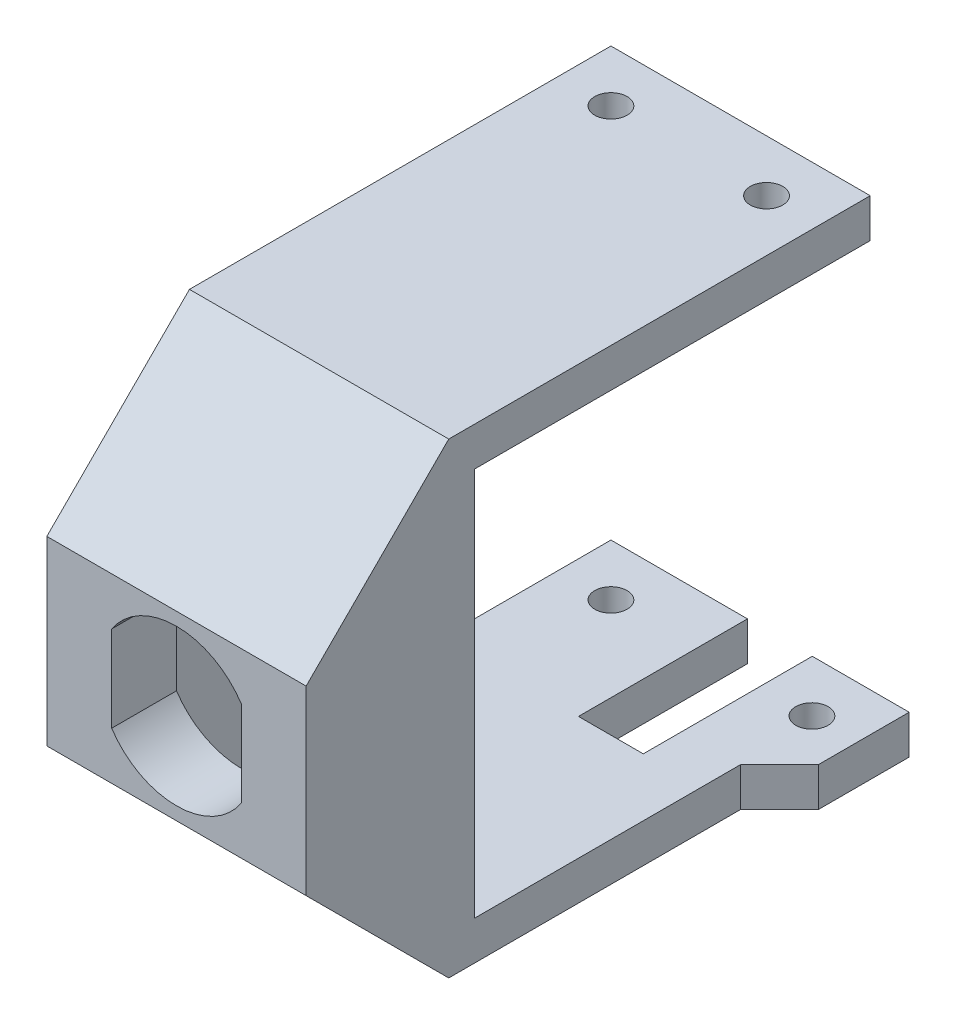
ISO-10303-21;
HEADER;
FILE_DESCRIPTION(('STEP AP214'),'2;1');
FILE_NAME('part.step','',(''),(''),'','','');
FILE_SCHEMA(('AUTOMOTIVE_DESIGN { 1 0 10303 214 1 1 1 1 }'));
ENDSEC;
DATA;
#1=APPLICATION_CONTEXT('core data for automotive mechanical design processes');
#2=APPLICATION_PROTOCOL_DEFINITION('international standard','automotive_design',2000,#1);
#3=PRODUCT_CONTEXT('',#1,'mechanical');
#4=PRODUCT('Part','Part','',(#3));
#5=PRODUCT_RELATED_PRODUCT_CATEGORY('part','',(#4));
#6=PRODUCT_DEFINITION_FORMATION('','',#4);
#7=PRODUCT_DEFINITION_CONTEXT('part definition',#1,'design');
#8=PRODUCT_DEFINITION('design','',#6,#7);
#9=PRODUCT_DEFINITION_SHAPE('','',#8);
#10=(LENGTH_UNIT() NAMED_UNIT(*) SI_UNIT(.MILLI.,.METRE.));
#11=(NAMED_UNIT(*) PLANE_ANGLE_UNIT() SI_UNIT($,.RADIAN.));
#12=(NAMED_UNIT(*) SI_UNIT($,.STERADIAN.) SOLID_ANGLE_UNIT());
#13=UNCERTAINTY_MEASURE_WITH_UNIT(LENGTH_MEASURE(1.E-05),#10,'distance_accuracy_value','');
#14=(GEOMETRIC_REPRESENTATION_CONTEXT(3) GLOBAL_UNCERTAINTY_ASSIGNED_CONTEXT((#13)) GLOBAL_UNIT_ASSIGNED_CONTEXT((#10,
#11,#12)) REPRESENTATION_CONTEXT('',''));
#15=CARTESIAN_POINT('',(0.,0.,0.));
#16=DIRECTION('',(0.,0.,1.));
#17=DIRECTION('',(1.,0.,0.));
#18=AXIS2_PLACEMENT_3D('',#15,#16,#17);
#19=CARTESIAN_POINT('',(109.3,15.,43.51));
#20=DIRECTION('',(-1.,0.,0.));
#21=DIRECTION('',(0.,0.,1.));
#22=AXIS2_PLACEMENT_3D('',#19,#20,#21);
#23=PLANE('',#22);
#24=DIRECTION('',(0.,-1.,0.));
#25=VECTOR('',#24,1.);
#26=CARTESIAN_POINT('',(109.3,15.,30.51));
#27=LINE('',#26,#25);
#28=CARTESIAN_POINT('',(109.3,15.,30.51));
#29=VERTEX_POINT('',#28);
#30=CARTESIAN_POINT('',(109.3,-15.,30.51));
#31=VERTEX_POINT('',#30);
#32=EDGE_CURVE('E224',#29,#31,#27,.T.);
#33=ORIENTED_EDGE('',*,*,#32,.F.);
#34=DIRECTION('',(0.,0.,1.));
#35=VECTOR('',#34,1.);
#36=CARTESIAN_POINT('',(109.3,15.,-20.2237484161567));
#37=LINE('',#36,#35);
#38=CARTESIAN_POINT('',(109.3,15.,0.));
#39=VERTEX_POINT('',#38);
#40=EDGE_CURVE('E320',#39,#29,#37,.T.);
#41=ORIENTED_EDGE('',*,*,#40,.F.);
#42=DIRECTION('',(0.,-1.,0.));
#43=VECTOR('',#42,1.);
#44=CARTESIAN_POINT('',(109.3,0.,0.));
#45=LINE('',#44,#43);
#46=CARTESIAN_POINT('',(109.3,18.,0.));
#47=VERTEX_POINT('',#46);
#48=EDGE_CURVE('E310',#47,#39,#45,.T.);
#49=ORIENTED_EDGE('',*,*,#48,.F.);
#50=DIRECTION('',(0.,0.,1.));
#51=VECTOR('',#50,1.);
#52=CARTESIAN_POINT('',(109.3,18.,-20.2237484161567));
#53=LINE('',#52,#51);
#54=CARTESIAN_POINT('',(109.3,18.,32.5099999999999));
#55=VERTEX_POINT('',#54);
#56=EDGE_CURVE('E271',#47,#55,#53,.T.);
#57=ORIENTED_EDGE('',*,*,#56,.T.);
#58=DIRECTION('',(0.,-0.707106781186548,0.707106781186548));
#59=VECTOR('',#58,1.);
#60=CARTESIAN_POINT('',(109.3,18.,32.5099999999999));
#61=LINE('',#60,#59);
#62=CARTESIAN_POINT('',(109.3,6.99999999999998,43.51));
#63=VERTEX_POINT('',#62);
#64=EDGE_CURVE('E247',#55,#63,#61,.T.);
#65=ORIENTED_EDGE('',*,*,#64,.T.);
#66=DIRECTION('',(0.,1.,0.));
#67=VECTOR('',#66,1.);
#68=CARTESIAN_POINT('',(109.3,15.,43.51));
#69=LINE('',#68,#67);
#70=CARTESIAN_POINT('',(109.3,-6.99999999999996,43.51));
#71=VERTEX_POINT('',#70);
#72=EDGE_CURVE('E278',#71,#63,#69,.T.);
#73=ORIENTED_EDGE('',*,*,#72,.F.);
#74=DIRECTION('',(0.,0.707106781186548,0.707106781186548));
#75=VECTOR('',#74,1.);
#76=CARTESIAN_POINT('',(109.3,-6.99999999999997,43.51));
#77=LINE('',#76,#75);
#78=CARTESIAN_POINT('',(109.3,-18.,32.5099999999999));
#79=VERTEX_POINT('',#78);
#80=EDGE_CURVE('E245',#71,#79,#77,.F.);
#81=ORIENTED_EDGE('',*,*,#80,.T.);
#82=DIRECTION('',(0.,0.,1.));
#83=VECTOR('',#82,1.);
#84=CARTESIAN_POINT('',(109.3,-18.,-20.2237484161567));
#85=LINE('',#84,#83);
#86=CARTESIAN_POINT('',(109.3,-18.,10.));
#87=VERTEX_POINT('',#86);
#88=EDGE_CURVE('E346',#87,#79,#85,.T.);
#89=ORIENTED_EDGE('',*,*,#88,.F.);
#90=DIRECTION('',(0.,-1.,0.));
#91=VECTOR('',#90,1.);
#92=CARTESIAN_POINT('',(109.3,-4.55892797145652,10.));
#93=LINE('',#92,#91);
#94=CARTESIAN_POINT('',(109.3,-15.,10.));
#95=VERTEX_POINT('',#94);
#96=EDGE_CURVE('E384',#95,#87,#93,.T.);
#97=ORIENTED_EDGE('',*,*,#96,.F.);
#98=DIRECTION('',(0.,0.,1.));
#99=VECTOR('',#98,1.);
#100=CARTESIAN_POINT('',(109.3,-15.,-20.2237484161567));
#101=LINE('',#100,#99);
#102=EDGE_CURVE('E337',#95,#31,#101,.T.);
#103=ORIENTED_EDGE('',*,*,#102,.T.);
#104=EDGE_LOOP('',(#33,#41,#49,#57,#65,#73,#81,#89,#97,#103));
#105=FACE_BOUND('',#104,.T.);
#106=ADVANCED_FACE('F40',(#105),#23,.F.);
#107=CARTESIAN_POINT('',(0.,0.,0.));
#108=DIRECTION('',(0.,0.,1.));
#109=DIRECTION('',(1.,0.,0.));
#110=AXIS2_PLACEMENT_3D('',#107,#108,#109);
#111=PLANE('',#110);
#112=DIRECTION('',(-1.,0.,0.));
#113=VECTOR('',#112,1.);
#114=CARTESIAN_POINT('',(0.,-15.,0.));
#115=LINE('',#114,#113);
#116=CARTESIAN_POINT('',(99.8296637485555,-15.,0.));
#117=VERTEX_POINT('',#116);
#118=CARTESIAN_POINT('',(89.3,-15.,0.));
#119=VERTEX_POINT('',#118);
#120=EDGE_CURVE('E336',#117,#119,#115,.T.);
#121=ORIENTED_EDGE('',*,*,#120,.F.);
#122=DIRECTION('',(0.,-1.,0.));
#123=VECTOR('',#122,1.);
#124=CARTESIAN_POINT('',(99.8296637485555,18.001,0.));
#125=LINE('',#124,#123);
#126=CARTESIAN_POINT('',(99.8296637485555,-18.,0.));
#127=VERTEX_POINT('',#126);
#128=EDGE_CURVE('E356',#117,#127,#125,.T.);
#129=ORIENTED_EDGE('',*,*,#128,.T.);
#130=DIRECTION('',(-1.,0.,0.));
#131=VECTOR('',#130,1.);
#132=CARTESIAN_POINT('',(0.,-18.,0.));
#133=LINE('',#132,#131);
#134=CARTESIAN_POINT('',(89.3,-18.,0.));
#135=VERTEX_POINT('',#134);
#136=EDGE_CURVE('E350',#127,#135,#133,.T.);
#137=ORIENTED_EDGE('',*,*,#136,.T.);
#138=DIRECTION('',(0.,1.,0.));
#139=VECTOR('',#138,1.);
#140=CARTESIAN_POINT('',(89.3,0.,0.));
#141=LINE('',#140,#139);
#142=EDGE_CURVE('E335',#135,#119,#141,.T.);
#143=ORIENTED_EDGE('',*,*,#142,.T.);
#144=EDGE_LOOP('',(#121,#129,#137,#143));
#145=FACE_BOUND('',#144,.T.);
#146=ADVANCED_FACE('F469',(#145),#111,.F.);
#147=CARTESIAN_POINT('',(0.,0.,43.51));
#148=DIRECTION('',(0.,0.,1.));
#149=DIRECTION('',(1.,0.,0.));
#150=AXIS2_PLACEMENT_3D('',#147,#148,#149);
#151=PLANE('',#150);
#152=ORIENTED_EDGE('',*,*,#72,.T.);
#153=DIRECTION('',(-1.,0.,0.));
#154=VECTOR('',#153,1.);
#155=CARTESIAN_POINT('',(89.3,6.99999999999998,43.51));
#156=LINE('',#155,#154);
#157=CARTESIAN_POINT('',(89.3,6.99999999999998,43.51));
#158=VERTEX_POINT('',#157);
#159=EDGE_CURVE('E252',#63,#158,#156,.T.);
#160=ORIENTED_EDGE('',*,*,#159,.T.);
#161=DIRECTION('',(0.,-1.,0.));
#162=VECTOR('',#161,1.);
#163=CARTESIAN_POINT('',(89.3,15.,43.51));
#164=LINE('',#163,#162);
#165=CARTESIAN_POINT('',(89.3,-6.99999999999996,43.51));
#166=VERTEX_POINT('',#165);
#167=EDGE_CURVE('E260',#158,#166,#164,.T.);
#168=ORIENTED_EDGE('',*,*,#167,.T.);
#169=DIRECTION('',(1.,0.,0.));
#170=VECTOR('',#169,1.);
#171=CARTESIAN_POINT('',(0.,-6.99999999999998,43.51));
#172=LINE('',#171,#170);
#173=EDGE_CURVE('E249',#166,#71,#172,.T.);
#174=ORIENTED_EDGE('',*,*,#173,.T.);
#175=EDGE_LOOP('',(#152,#160,#168,#174));
#176=FACE_BOUND('',#175,.T.);
#177=DIRECTION('',(0.,1.,0.));
#178=VECTOR('',#177,1.);
#179=CARTESIAN_POINT('',(104.3,-3.31662479035541,43.51));
#180=LINE('',#179,#178);
#181=CARTESIAN_POINT('',(104.3,-3.31662479035541,43.51));
#182=VERTEX_POINT('',#181);
#183=CARTESIAN_POINT('',(104.3,3.31662479035541,43.51));
#184=VERTEX_POINT('',#183);
#185=EDGE_CURVE('E315',#182,#184,#180,.T.);
#186=ORIENTED_EDGE('',*,*,#185,.F.);
#187=CARTESIAN_POINT('',(99.3,0.,43.51));
#188=DIRECTION('',(0.,0.,1.));
#189=DIRECTION('',(1.,0.,0.));
#190=AXIS2_PLACEMENT_3D('',#187,#188,#189);
#191=CIRCLE('',#190,6.00000000000001);
#192=CARTESIAN_POINT('',(94.3,-3.3166247903554,43.51));
#193=VERTEX_POINT('',#192);
#194=EDGE_CURVE('E300',#193,#182,#191,.T.);
#195=ORIENTED_EDGE('',*,*,#194,.F.);
#196=DIRECTION('',(0.,-1.,0.));
#197=VECTOR('',#196,1.);
#198=CARTESIAN_POINT('',(94.3,3.3166247903554,43.51));
#199=LINE('',#198,#197);
#200=CARTESIAN_POINT('',(94.3,3.3166247903554,43.51));
#201=VERTEX_POINT('',#200);
#202=EDGE_CURVE('E296',#201,#193,#199,.T.);
#203=ORIENTED_EDGE('',*,*,#202,.F.);
#204=CARTESIAN_POINT('',(99.3,0.,43.51));
#205=DIRECTION('',(0.,0.,1.));
#206=DIRECTION('',(1.,0.,0.));
#207=AXIS2_PLACEMENT_3D('',#204,#205,#206);
#208=CIRCLE('',#207,6.00000000000001);
#209=EDGE_CURVE('E312',#184,#201,#208,.T.);
#210=ORIENTED_EDGE('',*,*,#209,.F.);
#211=EDGE_LOOP('',(#186,#195,#203,#210));
#212=FACE_BOUND('',#211,.T.);
#213=ADVANCED_FACE('F281',(#176,#212),#151,.T.);
#214=CARTESIAN_POINT('',(0.,0.,38.51));
#215=DIRECTION('',(0.,0.,1.));
#216=DIRECTION('',(1.,0.,0.));
#217=AXIS2_PLACEMENT_3D('',#214,#215,#216);
#218=PLANE('',#217);
#219=DIRECTION('',(1.,0.,0.));
#220=VECTOR('',#219,1.);
#221=CARTESIAN_POINT('',(109.3,7.00000000000004,38.51));
#222=LINE('',#221,#220);
#223=CARTESIAN_POINT('',(92.3,7.00000000000004,38.51));
#224=VERTEX_POINT('',#223);
#225=CARTESIAN_POINT('',(106.3,7.00000000000004,38.51));
#226=VERTEX_POINT('',#225);
#227=EDGE_CURVE('E223',#224,#226,#222,.T.);
#228=ORIENTED_EDGE('',*,*,#227,.T.);
#229=DIRECTION('',(0.,1.,0.));
#230=VECTOR('',#229,1.);
#231=CARTESIAN_POINT('',(106.3,7.00000000000004,38.51));
#232=LINE('',#231,#230);
#233=CARTESIAN_POINT('',(106.3,-7.00000000000003,38.51));
#234=VERTEX_POINT('',#233);
#235=EDGE_CURVE('E205',#234,#226,#232,.T.);
#236=ORIENTED_EDGE('',*,*,#235,.F.);
#237=DIRECTION('',(-1.,0.,0.));
#238=VECTOR('',#237,1.);
#239=CARTESIAN_POINT('',(89.3,-7.00000000000004,38.51));
#240=LINE('',#239,#238);
#241=CARTESIAN_POINT('',(92.3,-7.00000000000003,38.51));
#242=VERTEX_POINT('',#241);
#243=EDGE_CURVE('E220',#234,#242,#240,.T.);
#244=ORIENTED_EDGE('',*,*,#243,.T.);
#245=DIRECTION('',(0.,1.,0.));
#246=VECTOR('',#245,1.);
#247=CARTESIAN_POINT('',(92.3,7.00000000000004,38.51));
#248=LINE('',#247,#246);
#249=EDGE_CURVE('E425',#242,#224,#248,.T.);
#250=ORIENTED_EDGE('',*,*,#249,.T.);
#251=EDGE_LOOP('',(#228,#236,#244,#250));
#252=FACE_BOUND('',#251,.T.);
#253=CARTESIAN_POINT('',(99.3,0.,38.51));
#254=DIRECTION('',(0.,0.,1.));
#255=DIRECTION('',(1.,0.,0.));
#256=AXIS2_PLACEMENT_3D('',#253,#254,#255);
#257=CIRCLE('',#256,6.00000000000001);
#258=CARTESIAN_POINT('',(94.3,-3.3166247903554,38.51));
#259=VERTEX_POINT('',#258);
#260=CARTESIAN_POINT('',(104.3,-3.31662479035541,38.51));
#261=VERTEX_POINT('',#260);
#262=EDGE_CURVE('E307',#259,#261,#257,.T.);
#263=ORIENTED_EDGE('',*,*,#262,.T.);
#264=DIRECTION('',(0.,1.,0.));
#265=VECTOR('',#264,1.);
#266=CARTESIAN_POINT('',(104.3,-3.31662479035541,38.51));
#267=LINE('',#266,#265);
#268=CARTESIAN_POINT('',(104.3,3.31662479035541,38.51));
#269=VERTEX_POINT('',#268);
#270=EDGE_CURVE('E304',#261,#269,#267,.T.);
#271=ORIENTED_EDGE('',*,*,#270,.T.);
#272=CARTESIAN_POINT('',(99.3,0.,38.51));
#273=DIRECTION('',(0.,0.,1.));
#274=DIRECTION('',(1.,0.,0.));
#275=AXIS2_PLACEMENT_3D('',#272,#273,#274);
#276=CIRCLE('',#275,6.00000000000001);
#277=CARTESIAN_POINT('',(94.3,3.3166247903554,38.51));
#278=VERTEX_POINT('',#277);
#279=EDGE_CURVE('E301',#269,#278,#276,.T.);
#280=ORIENTED_EDGE('',*,*,#279,.T.);
#281=DIRECTION('',(0.,-1.,0.));
#282=VECTOR('',#281,1.);
#283=CARTESIAN_POINT('',(94.3,3.3166247903554,38.51));
#284=LINE('',#283,#282);
#285=EDGE_CURVE('E297',#278,#259,#284,.T.);
#286=ORIENTED_EDGE('',*,*,#285,.T.);
#287=EDGE_LOOP('',(#263,#271,#280,#286));
#288=FACE_BOUND('',#287,.T.);
#289=ADVANCED_FACE('F217',(#252,#288),#218,.F.);
#290=CARTESIAN_POINT('',(89.3,15.,43.51));
#291=DIRECTION('',(1.,0.,0.));
#292=DIRECTION('',(0.,0.,-1.));
#293=AXIS2_PLACEMENT_3D('',#290,#291,#292);
#294=PLANE('',#293);
#295=ORIENTED_EDGE('',*,*,#167,.F.);
#296=DIRECTION('',(0.,0.707106781186548,-0.707106781186548));
#297=VECTOR('',#296,1.);
#298=CARTESIAN_POINT('',(89.3,18.,32.5099999999999));
#299=LINE('',#298,#297);
#300=CARTESIAN_POINT('',(89.3,18.,32.5099999999999));
#301=VERTEX_POINT('',#300);
#302=EDGE_CURVE('E49',#158,#301,#299,.T.);
#303=ORIENTED_EDGE('',*,*,#302,.T.);
#304=DIRECTION('',(0.,0.,1.));
#305=VECTOR('',#304,1.);
#306=CARTESIAN_POINT('',(89.3,18.,-20.2237484161567));
#307=LINE('',#306,#305);
#308=CARTESIAN_POINT('',(89.3,18.,0.));
#309=VERTEX_POINT('',#308);
#310=EDGE_CURVE('E259',#309,#301,#307,.T.);
#311=ORIENTED_EDGE('',*,*,#310,.F.);
#312=DIRECTION('',(0.,-1.,0.));
#313=VECTOR('',#312,1.);
#314=CARTESIAN_POINT('',(89.3,0.,0.));
#315=LINE('',#314,#313);
#316=CARTESIAN_POINT('',(89.3,15.,0.));
#317=VERTEX_POINT('',#316);
#318=EDGE_CURVE('E329',#309,#317,#315,.T.);
#319=ORIENTED_EDGE('',*,*,#318,.T.);
#320=DIRECTION('',(0.,0.,1.));
#321=VECTOR('',#320,1.);
#322=CARTESIAN_POINT('',(89.3,15.,-20.2237484161567));
#323=LINE('',#322,#321);
#324=CARTESIAN_POINT('',(89.3,15.,30.51));
#325=VERTEX_POINT('',#324);
#326=EDGE_CURVE('E270',#317,#325,#323,.T.);
#327=ORIENTED_EDGE('',*,*,#326,.T.);
#328=DIRECTION('',(0.,-1.,0.));
#329=VECTOR('',#328,1.);
#330=CARTESIAN_POINT('',(89.3,15.,30.51));
#331=LINE('',#330,#329);
#332=CARTESIAN_POINT('',(89.3,-15.,30.51));
#333=VERTEX_POINT('',#332);
#334=EDGE_CURVE('E423',#325,#333,#331,.T.);
#335=ORIENTED_EDGE('',*,*,#334,.T.);
#336=DIRECTION('',(0.,0.,1.));
#337=VECTOR('',#336,1.);
#338=CARTESIAN_POINT('',(89.3,-15.,-20.2237484161567));
#339=LINE('',#338,#337);
#340=EDGE_CURVE('E340',#119,#333,#339,.T.);
#341=ORIENTED_EDGE('',*,*,#340,.F.);
#342=ORIENTED_EDGE('',*,*,#142,.F.);
#343=DIRECTION('',(0.,0.,1.));
#344=VECTOR('',#343,1.);
#345=CARTESIAN_POINT('',(89.3,-18.,-20.2237484161567));
#346=LINE('',#345,#344);
#347=CARTESIAN_POINT('',(89.3,-18.,32.5099999999999));
#348=VERTEX_POINT('',#347);
#349=EDGE_CURVE('E344',#135,#348,#346,.T.);
#350=ORIENTED_EDGE('',*,*,#349,.T.);
#351=DIRECTION('',(0.,-0.707106781186548,-0.707106781186548));
#352=VECTOR('',#351,1.);
#353=CARTESIAN_POINT('',(89.3,-6.99999999999997,43.51));
#354=LINE('',#353,#352);
#355=EDGE_CURVE('E61',#348,#166,#354,.F.);
#356=ORIENTED_EDGE('',*,*,#355,.T.);
#357=EDGE_LOOP('',(#295,#303,#311,#319,#327,#335,#341,#342,#350,#356));
#358=FACE_BOUND('',#357,.T.);
#359=ADVANCED_FACE('F257',(#358),#294,.F.);
#360=CARTESIAN_POINT('',(99.3,0.,43.51));
#361=DIRECTION('',(0.,0.,-1.));
#362=DIRECTION('',(-1.,0.,0.));
#363=AXIS2_PLACEMENT_3D('',#360,#361,#362);
#364=CYLINDRICAL_SURFACE('',#363,6.00000000000001);
#365=ORIENTED_EDGE('',*,*,#262,.F.);
#366=DIRECTION('',(0.,0.,-1.));
#367=VECTOR('',#366,1.);
#368=CARTESIAN_POINT('',(94.3,-3.3166247903554,43.51));
#369=LINE('',#368,#367);
#370=EDGE_CURVE('E293',#193,#259,#369,.T.);
#371=ORIENTED_EDGE('',*,*,#370,.F.);
#372=ORIENTED_EDGE('',*,*,#194,.T.);
#373=DIRECTION('',(0.,0.,-1.));
#374=VECTOR('',#373,1.);
#375=CARTESIAN_POINT('',(104.3,-3.31662479035541,43.51));
#376=LINE('',#375,#374);
#377=EDGE_CURVE('E284',#182,#261,#376,.T.);
#378=ORIENTED_EDGE('',*,*,#377,.T.);
#379=EDGE_LOOP('',(#365,#371,#372,#378));
#380=FACE_BOUND('',#379,.T.);
#381=ADVANCED_FACE('F555',(#380),#364,.F.);
#382=CARTESIAN_POINT('',(104.3,-3.31662479035541,43.51));
#383=DIRECTION('',(-1.,0.,0.));
#384=DIRECTION('',(0.,0.,1.));
#385=AXIS2_PLACEMENT_3D('',#382,#383,#384);
#386=PLANE('',#385);
#387=ORIENTED_EDGE('',*,*,#270,.F.);
#388=ORIENTED_EDGE('',*,*,#377,.F.);
#389=ORIENTED_EDGE('',*,*,#185,.T.);
#390=DIRECTION('',(0.,0.,-1.));
#391=VECTOR('',#390,1.);
#392=CARTESIAN_POINT('',(104.3,3.31662479035541,43.51));
#393=LINE('',#392,#391);
#394=EDGE_CURVE('E287',#184,#269,#393,.T.);
#395=ORIENTED_EDGE('',*,*,#394,.T.);
#396=EDGE_LOOP('',(#387,#388,#389,#395));
#397=FACE_BOUND('',#396,.T.);
#398=ADVANCED_FACE('F551',(#397),#386,.T.);
#399=CARTESIAN_POINT('',(99.3,0.,43.51));
#400=DIRECTION('',(0.,0.,-1.));
#401=DIRECTION('',(-1.,0.,0.));
#402=AXIS2_PLACEMENT_3D('',#399,#400,#401);
#403=CYLINDRICAL_SURFACE('',#402,6.00000000000001);
#404=ORIENTED_EDGE('',*,*,#279,.F.);
#405=ORIENTED_EDGE('',*,*,#394,.F.);
#406=ORIENTED_EDGE('',*,*,#209,.T.);
#407=DIRECTION('',(0.,0.,-1.));
#408=VECTOR('',#407,1.);
#409=CARTESIAN_POINT('',(94.3,3.3166247903554,43.51));
#410=LINE('',#409,#408);
#411=EDGE_CURVE('E291',#201,#278,#410,.T.);
#412=ORIENTED_EDGE('',*,*,#411,.T.);
#413=EDGE_LOOP('',(#404,#405,#406,#412));
#414=FACE_BOUND('',#413,.T.);
#415=ADVANCED_FACE('F547',(#414),#403,.F.);
#416=CARTESIAN_POINT('',(94.3,3.3166247903554,43.51));
#417=DIRECTION('',(1.,0.,0.));
#418=DIRECTION('',(0.,0.,-1.));
#419=AXIS2_PLACEMENT_3D('',#416,#417,#418);
#420=PLANE('',#419);
#421=ORIENTED_EDGE('',*,*,#285,.F.);
#422=ORIENTED_EDGE('',*,*,#411,.F.);
#423=ORIENTED_EDGE('',*,*,#202,.T.);
#424=ORIENTED_EDGE('',*,*,#370,.T.);
#425=EDGE_LOOP('',(#421,#422,#423,#424));
#426=FACE_BOUND('',#425,.T.);
#427=ADVANCED_FACE('F543',(#426),#420,.T.);
#428=CARTESIAN_POINT('',(0.,15.,-20.2237484161567));
#429=DIRECTION('',(0.,1.,0.));
#430=DIRECTION('',(0.,0.,1.));
#431=AXIS2_PLACEMENT_3D('',#428,#429,#430);
#432=PLANE('',#431);
#433=CARTESIAN_POINT('',(105.3,15.,4.));
#434=DIRECTION('',(0.,1.,0.));
#435=DIRECTION('',(0.,0.,1.));
#436=AXIS2_PLACEMENT_3D('',#433,#434,#435);
#437=CIRCLE('',#436,1.25);
#438=CARTESIAN_POINT('',(105.3,15.,5.25));
#439=VERTEX_POINT('',#438);
#440=EDGE_CURVE('E404',#439,#439,#437,.F.);
#441=ORIENTED_EDGE('',*,*,#440,.F.);
#442=EDGE_LOOP('',(#441));
#443=FACE_BOUND('',#442,.T.);
#444=CARTESIAN_POINT('',(93.3,15.,4.));
#445=DIRECTION('',(0.,1.,0.));
#446=DIRECTION('',(0.,0.,1.));
#447=AXIS2_PLACEMENT_3D('',#444,#445,#446);
#448=CIRCLE('',#447,1.25);
#449=CARTESIAN_POINT('',(93.3,15.,5.25));
#450=VERTEX_POINT('',#449);
#451=EDGE_CURVE('E409',#450,#450,#448,.F.);
#452=ORIENTED_EDGE('',*,*,#451,.F.);
#453=EDGE_LOOP('',(#452));
#454=FACE_BOUND('',#453,.T.);
#455=ORIENTED_EDGE('',*,*,#40,.T.);
#456=DIRECTION('',(-1.,0.,0.));
#457=VECTOR('',#456,1.);
#458=CARTESIAN_POINT('',(89.3,15.,30.51));
#459=LINE('',#458,#457);
#460=CARTESIAN_POINT('',(106.3,15.,30.51));
#461=VERTEX_POINT('',#460);
#462=EDGE_CURVE('E230',#29,#461,#459,.T.);
#463=ORIENTED_EDGE('',*,*,#462,.T.);
#464=CARTESIAN_POINT('',(92.3,15.,30.51));
#465=VERTEX_POINT('',#464);
#466=EDGE_CURVE('E235',#461,#465,#459,.T.);
#467=ORIENTED_EDGE('',*,*,#466,.T.);
#468=DIRECTION('',(-1.,0.,0.));
#469=VECTOR('',#468,1.);
#470=CARTESIAN_POINT('',(92.3,15.,30.51));
#471=LINE('',#470,#469);
#472=EDGE_CURVE('E416',#465,#325,#471,.T.);
#473=ORIENTED_EDGE('',*,*,#472,.T.);
#474=ORIENTED_EDGE('',*,*,#326,.F.);
#475=DIRECTION('',(1.,0.,0.));
#476=VECTOR('',#475,1.);
#477=CARTESIAN_POINT('',(0.,15.,0.));
#478=LINE('',#477,#476);
#479=EDGE_CURVE('E319',#317,#39,#478,.T.);
#480=ORIENTED_EDGE('',*,*,#479,.T.);
#481=EDGE_LOOP('',(#455,#463,#467,#473,#474,#480));
#482=FACE_BOUND('',#481,.T.);
#483=ADVANCED_FACE('F446',(#443,#454,#482),#432,.F.);
#484=CARTESIAN_POINT('',(0.,18.,-20.2237484161567));
#485=DIRECTION('',(0.,-1.,0.));
#486=DIRECTION('',(0.,0.,-1.));
#487=AXIS2_PLACEMENT_3D('',#484,#485,#486);
#488=PLANE('',#487);
#489=CARTESIAN_POINT('',(105.3,18.,4.));
#490=DIRECTION('',(0.,1.,0.));
#491=DIRECTION('',(0.,0.,1.));
#492=AXIS2_PLACEMENT_3D('',#489,#490,#491);
#493=CIRCLE('',#492,1.25);
#494=CARTESIAN_POINT('',(105.3,18.,5.25));
#495=VERTEX_POINT('',#494);
#496=EDGE_CURVE('E412',#495,#495,#493,.T.);
#497=ORIENTED_EDGE('',*,*,#496,.F.);
#498=EDGE_LOOP('',(#497));
#499=FACE_BOUND('',#498,.T.);
#500=CARTESIAN_POINT('',(93.3,18.,4.));
#501=DIRECTION('',(0.,1.,0.));
#502=DIRECTION('',(0.,0.,1.));
#503=AXIS2_PLACEMENT_3D('',#500,#501,#502);
#504=CIRCLE('',#503,1.25);
#505=CARTESIAN_POINT('',(93.3,18.,5.25));
#506=VERTEX_POINT('',#505);
#507=EDGE_CURVE('E413',#506,#506,#504,.T.);
#508=ORIENTED_EDGE('',*,*,#507,.F.);
#509=EDGE_LOOP('',(#508));
#510=FACE_BOUND('',#509,.T.);
#511=ORIENTED_EDGE('',*,*,#310,.T.);
#512=DIRECTION('',(1.,0.,0.));
#513=VECTOR('',#512,1.);
#514=CARTESIAN_POINT('',(109.3,18.,32.5099999999999));
#515=LINE('',#514,#513);
#516=EDGE_CURVE('E242',#301,#55,#515,.T.);
#517=ORIENTED_EDGE('',*,*,#516,.T.);
#518=ORIENTED_EDGE('',*,*,#56,.F.);
#519=DIRECTION('',(-1.,0.,0.));
#520=VECTOR('',#519,1.);
#521=CARTESIAN_POINT('',(0.,18.,0.));
#522=LINE('',#521,#520);
#523=EDGE_CURVE('E269',#47,#309,#522,.T.);
#524=ORIENTED_EDGE('',*,*,#523,.T.);
#525=EDGE_LOOP('',(#511,#517,#518,#524));
#526=FACE_BOUND('',#525,.T.);
#527=ADVANCED_FACE('F266',(#499,#510,#526),#488,.F.);
#528=CARTESIAN_POINT('',(0.,0.,0.));
#529=DIRECTION('',(0.,0.,1.));
#530=DIRECTION('',(1.,0.,0.));
#531=AXIS2_PLACEMENT_3D('',#528,#529,#530);
#532=PLANE('',#531);
#533=ORIENTED_EDGE('',*,*,#318,.F.);
#534=ORIENTED_EDGE('',*,*,#523,.F.);
#535=ORIENTED_EDGE('',*,*,#48,.T.);
#536=ORIENTED_EDGE('',*,*,#479,.F.);
#537=EDGE_LOOP('',(#533,#534,#535,#536));
#538=FACE_BOUND('',#537,.T.);
#539=ADVANCED_FACE('F528',(#538),#532,.F.);
#540=CARTESIAN_POINT('',(0.,-15.,-20.2237484161567));
#541=DIRECTION('',(0.,-1.,0.));
#542=DIRECTION('',(0.,0.,-1.));
#543=AXIS2_PLACEMENT_3D('',#540,#541,#542);
#544=PLANE('',#543);
#545=CARTESIAN_POINT('',(93.3,-15.,4.));
#546=DIRECTION('',(0.,-1.,0.));
#547=DIRECTION('',(0.,0.,-1.));
#548=AXIS2_PLACEMENT_3D('',#545,#546,#547);
#549=CIRCLE('',#548,1.25);
#550=CARTESIAN_POINT('',(93.3,-15.,2.75));
#551=VERTEX_POINT('',#550);
#552=EDGE_CURVE('E400',#551,#551,#549,.F.);
#553=ORIENTED_EDGE('',*,*,#552,.F.);
#554=EDGE_LOOP('',(#553));
#555=FACE_BOUND('',#554,.T.);
#556=CARTESIAN_POINT('',(108.802663002275,-15.,4.));
#557=DIRECTION('',(0.,-1.,0.));
#558=DIRECTION('',(0.,0.,-1.));
#559=AXIS2_PLACEMENT_3D('',#556,#557,#558);
#560=CIRCLE('',#559,1.25);
#561=CARTESIAN_POINT('',(108.802663002275,-15.,2.75));
#562=VERTEX_POINT('',#561);
#563=EDGE_CURVE('E397',#562,#562,#560,.F.);
#564=ORIENTED_EDGE('',*,*,#563,.F.);
#565=EDGE_LOOP('',(#564));
#566=FACE_BOUND('',#565,.T.);
#567=ORIENTED_EDGE('',*,*,#340,.T.);
#568=DIRECTION('',(1.,0.,0.));
#569=VECTOR('',#568,1.);
#570=CARTESIAN_POINT('',(109.3,-15.,30.51));
#571=LINE('',#570,#569);
#572=CARTESIAN_POINT('',(92.3,-15.,30.51));
#573=VERTEX_POINT('',#572);
#574=EDGE_CURVE('E239',#333,#573,#571,.T.);
#575=ORIENTED_EDGE('',*,*,#574,.T.);
#576=CARTESIAN_POINT('',(106.3,-15.,30.51));
#577=VERTEX_POINT('',#576);
#578=EDGE_CURVE('E232',#573,#577,#571,.T.);
#579=ORIENTED_EDGE('',*,*,#578,.T.);
#580=DIRECTION('',(1.,0.,0.));
#581=VECTOR('',#580,1.);
#582=CARTESIAN_POINT('',(106.3,-15.,30.51));
#583=LINE('',#582,#581);
#584=EDGE_CURVE('E426',#577,#31,#583,.T.);
#585=ORIENTED_EDGE('',*,*,#584,.T.);
#586=ORIENTED_EDGE('',*,*,#102,.F.);
#587=DIRECTION('',(0.707106781186549,0.,-0.707106781186546));
#588=VECTOR('',#587,1.);
#589=CARTESIAN_POINT('',(109.3,-15.,10.));
#590=LINE('',#589,#588);
#591=CARTESIAN_POINT('',(112.302663002275,-15.,6.99733699772476));
#592=VERTEX_POINT('',#591);
#593=EDGE_CURVE('E369',#95,#592,#590,.T.);
#594=ORIENTED_EDGE('',*,*,#593,.T.);
#595=DIRECTION('',(0.,0.,-1.));
#596=VECTOR('',#595,1.);
#597=CARTESIAN_POINT('',(112.302663002275,-15.,6.99733699772476));
#598=LINE('',#597,#596);
#599=CARTESIAN_POINT('',(112.302663002275,-15.,0.));
#600=VERTEX_POINT('',#599);
#601=EDGE_CURVE('E387',#592,#600,#598,.T.);
#602=ORIENTED_EDGE('',*,*,#601,.T.);
#603=CARTESIAN_POINT('',(104.829663748556,-15.,0.));
#604=VERTEX_POINT('',#603);
#605=EDGE_CURVE('E332',#600,#604,#115,.T.);
#606=ORIENTED_EDGE('',*,*,#605,.T.);
#607=DIRECTION('',(0.,0.,-1.));
#608=VECTOR('',#607,1.);
#609=CARTESIAN_POINT('',(104.829663748556,-15.,0.));
#610=LINE('',#609,#608);
#611=CARTESIAN_POINT('',(104.829663748556,-15.,13.0349999999984));
#612=VERTEX_POINT('',#611);
#613=EDGE_CURVE('E366',#612,#604,#610,.T.);
#614=ORIENTED_EDGE('',*,*,#613,.F.);
#615=DIRECTION('',(-1.,0.,0.));
#616=VECTOR('',#615,1.);
#617=CARTESIAN_POINT('',(0.,-15.,13.0349999999984));
#618=LINE('',#617,#616);
#619=CARTESIAN_POINT('',(99.8296637485555,-15.,13.0349999999984));
#620=VERTEX_POINT('',#619);
#621=EDGE_CURVE('E355',#612,#620,#618,.T.);
#622=ORIENTED_EDGE('',*,*,#621,.T.);
#623=DIRECTION('',(0.,0.,1.));
#624=VECTOR('',#623,1.);
#625=CARTESIAN_POINT('',(99.8296637485555,-15.,0.));
#626=LINE('',#625,#624);
#627=EDGE_CURVE('E368',#117,#620,#626,.T.);
#628=ORIENTED_EDGE('',*,*,#627,.F.);
#629=ORIENTED_EDGE('',*,*,#120,.T.);
#630=EDGE_LOOP('',(#567,#575,#579,#585,#586,#594,#602,#606,#614,#622,#628,#629));
#631=FACE_BOUND('',#630,.T.);
#632=ADVANCED_FACE('F451',(#555,#566,#631),#544,.F.);
#633=CARTESIAN_POINT('',(0.,-18.,-20.2237484161567));
#634=DIRECTION('',(0.,-1.,0.));
#635=DIRECTION('',(1.,0.,0.));
#636=AXIS2_PLACEMENT_3D('',#633,#634,#635);
#637=PLANE('',#636);
#638=CARTESIAN_POINT('',(93.3,-18.,4.));
#639=DIRECTION('',(0.,-1.,0.));
#640=DIRECTION('',(0.,0.,-1.));
#641=AXIS2_PLACEMENT_3D('',#638,#639,#640);
#642=CIRCLE('',#641,1.25);
#643=CARTESIAN_POINT('',(93.3,-18.,2.75));
#644=VERTEX_POINT('',#643);
#645=EDGE_CURVE('E393',#644,#644,#642,.T.);
#646=ORIENTED_EDGE('',*,*,#645,.F.);
#647=EDGE_LOOP('',(#646));
#648=FACE_BOUND('',#647,.T.);
#649=CARTESIAN_POINT('',(108.802663002275,-18.,4.));
#650=DIRECTION('',(0.,-1.,0.));
#651=DIRECTION('',(0.,0.,-1.));
#652=AXIS2_PLACEMENT_3D('',#649,#650,#651);
#653=CIRCLE('',#652,1.25);
#654=CARTESIAN_POINT('',(108.802663002275,-18.,2.75));
#655=VERTEX_POINT('',#654);
#656=EDGE_CURVE('E401',#655,#655,#653,.T.);
#657=ORIENTED_EDGE('',*,*,#656,.F.);
#658=EDGE_LOOP('',(#657));
#659=FACE_BOUND('',#658,.T.);
#660=ORIENTED_EDGE('',*,*,#88,.T.);
#661=DIRECTION('',(-1.,0.,0.));
#662=VECTOR('',#661,1.);
#663=CARTESIAN_POINT('',(0.,-18.,32.5099999999999));
#664=LINE('',#663,#662);
#665=EDGE_CURVE('E11',#79,#348,#664,.T.);
#666=ORIENTED_EDGE('',*,*,#665,.T.);
#667=ORIENTED_EDGE('',*,*,#349,.F.);
#668=ORIENTED_EDGE('',*,*,#136,.F.);
#669=DIRECTION('',(0.,0.,-1.));
#670=VECTOR('',#669,1.);
#671=CARTESIAN_POINT('',(99.8296637485555,-18.,0.));
#672=LINE('',#671,#670);
#673=CARTESIAN_POINT('',(99.8296637485555,-18.,13.0349999999984));
#674=VERTEX_POINT('',#673);
#675=EDGE_CURVE('E372',#674,#127,#672,.T.);
#676=ORIENTED_EDGE('',*,*,#675,.F.);
#677=DIRECTION('',(1.,0.,0.));
#678=VECTOR('',#677,1.);
#679=CARTESIAN_POINT('',(0.,-18.,13.0349999999984));
#680=LINE('',#679,#678);
#681=CARTESIAN_POINT('',(104.829663748556,-18.,13.0349999999984));
#682=VERTEX_POINT('',#681);
#683=EDGE_CURVE('E341',#674,#682,#680,.T.);
#684=ORIENTED_EDGE('',*,*,#683,.T.);
#685=DIRECTION('',(0.,0.,1.));
#686=VECTOR('',#685,1.);
#687=CARTESIAN_POINT('',(104.829663748556,-18.,0.));
#688=LINE('',#687,#686);
#689=CARTESIAN_POINT('',(104.829663748556,-18.,0.));
#690=VERTEX_POINT('',#689);
#691=EDGE_CURVE('E360',#690,#682,#688,.T.);
#692=ORIENTED_EDGE('',*,*,#691,.F.);
#693=CARTESIAN_POINT('',(112.302663002275,-18.,0.));
#694=VERTEX_POINT('',#693);
#695=EDGE_CURVE('E323',#694,#690,#133,.T.);
#696=ORIENTED_EDGE('',*,*,#695,.F.);
#697=DIRECTION('',(0.,0.,1.));
#698=VECTOR('',#697,1.);
#699=CARTESIAN_POINT('',(112.302663002275,-18.,6.99733699772476));
#700=LINE('',#699,#698);
#701=CARTESIAN_POINT('',(112.302663002275,-18.,6.99733699772476));
#702=VERTEX_POINT('',#701);
#703=EDGE_CURVE('E390',#694,#702,#700,.T.);
#704=ORIENTED_EDGE('',*,*,#703,.T.);
#705=DIRECTION('',(-0.707106781186549,0.,0.707106781186546));
#706=VECTOR('',#705,1.);
#707=CARTESIAN_POINT('',(109.3,-18.,10.));
#708=LINE('',#707,#706);
#709=EDGE_CURVE('E382',#702,#87,#708,.T.);
#710=ORIENTED_EDGE('',*,*,#709,.T.);
#711=EDGE_LOOP('',(#660,#666,#667,#668,#676,#684,#692,#696,#704,#710));
#712=FACE_BOUND('',#711,.T.);
#713=ADVANCED_FACE('F500',(#648,#659,#712),#637,.T.);
#714=ORIENTED_EDGE('',*,*,#695,.T.);
#715=DIRECTION('',(0.,-1.,0.));
#716=VECTOR('',#715,1.);
#717=CARTESIAN_POINT('',(104.829663748556,18.001,0.));
#718=LINE('',#717,#716);
#719=EDGE_CURVE('E359',#604,#690,#718,.T.);
#720=ORIENTED_EDGE('',*,*,#719,.F.);
#721=ORIENTED_EDGE('',*,*,#605,.F.);
#722=DIRECTION('',(0.,-1.,0.));
#723=VECTOR('',#722,1.);
#724=CARTESIAN_POINT('',(112.302663002275,-4.55892797145652,0.));
#725=LINE('',#724,#723);
#726=EDGE_CURVE('E378',#600,#694,#725,.T.);
#727=ORIENTED_EDGE('',*,*,#726,.T.);
#728=EDGE_LOOP('',(#714,#720,#721,#727));
#729=FACE_BOUND('',#728,.T.);
#730=ADVANCED_FACE('F476',(#729),#111,.F.);
#731=CARTESIAN_POINT('',(99.8296637485555,18.001,0.));
#732=DIRECTION('',(-1.,0.,0.));
#733=DIRECTION('',(0.,0.,1.));
#734=AXIS2_PLACEMENT_3D('',#731,#732,#733);
#735=PLANE('',#734);
#736=ORIENTED_EDGE('',*,*,#627,.T.);
#737=DIRECTION('',(0.,-1.,0.));
#738=VECTOR('',#737,1.);
#739=CARTESIAN_POINT('',(99.8296637485555,18.001,13.0349999999984));
#740=LINE('',#739,#738);
#741=EDGE_CURVE('E353',#620,#674,#740,.T.);
#742=ORIENTED_EDGE('',*,*,#741,.T.);
#743=ORIENTED_EDGE('',*,*,#675,.T.);
#744=ORIENTED_EDGE('',*,*,#128,.F.);
#745=EDGE_LOOP('',(#736,#742,#743,#744));
#746=FACE_BOUND('',#745,.T.);
#747=ADVANCED_FACE('F523',(#746),#735,.F.);
#748=CARTESIAN_POINT('',(104.829663748556,18.001,0.));
#749=DIRECTION('',(1.,0.,0.));
#750=DIRECTION('',(0.,0.,-1.));
#751=AXIS2_PLACEMENT_3D('',#748,#749,#750);
#752=PLANE('',#751);
#753=ORIENTED_EDGE('',*,*,#613,.T.);
#754=ORIENTED_EDGE('',*,*,#719,.T.);
#755=ORIENTED_EDGE('',*,*,#691,.T.);
#756=DIRECTION('',(0.,-1.,0.));
#757=VECTOR('',#756,1.);
#758=CARTESIAN_POINT('',(104.829663748556,18.001,13.0349999999984));
#759=LINE('',#758,#757);
#760=EDGE_CURVE('E362',#612,#682,#759,.T.);
#761=ORIENTED_EDGE('',*,*,#760,.F.);
#762=EDGE_LOOP('',(#753,#754,#755,#761));
#763=FACE_BOUND('',#762,.T.);
#764=ADVANCED_FACE('F516',(#763),#752,.F.);
#765=CARTESIAN_POINT('',(0.,18.001,13.0349999999984));
#766=DIRECTION('',(0.,0.,-1.));
#767=DIRECTION('',(-1.,0.,0.));
#768=AXIS2_PLACEMENT_3D('',#765,#766,#767);
#769=PLANE('',#768);
#770=ORIENTED_EDGE('',*,*,#760,.T.);
#771=ORIENTED_EDGE('',*,*,#683,.F.);
#772=ORIENTED_EDGE('',*,*,#741,.F.);
#773=ORIENTED_EDGE('',*,*,#621,.F.);
#774=EDGE_LOOP('',(#770,#771,#772,#773));
#775=FACE_BOUND('',#774,.T.);
#776=ADVANCED_FACE('F520',(#775),#769,.T.);
#777=CARTESIAN_POINT('',(109.3,-4.55892797145652,10.));
#778=DIRECTION('',(0.707106781186546,0.,0.707106781186549));
#779=DIRECTION('',(0.707106781186549,0.,-0.707106781186546));
#780=AXIS2_PLACEMENT_3D('',#777,#778,#779);
#781=PLANE('',#780);
#782=ORIENTED_EDGE('',*,*,#593,.F.);
#783=ORIENTED_EDGE('',*,*,#96,.T.);
#784=ORIENTED_EDGE('',*,*,#709,.F.);
#785=DIRECTION('',(0.,-1.,0.));
#786=VECTOR('',#785,1.);
#787=CARTESIAN_POINT('',(112.302663002275,-4.55892797145652,6.99733699772476));
#788=LINE('',#787,#786);
#789=EDGE_CURVE('E381',#592,#702,#788,.T.);
#790=ORIENTED_EDGE('',*,*,#789,.F.);
#791=EDGE_LOOP('',(#782,#783,#784,#790));
#792=FACE_BOUND('',#791,.T.);
#793=ADVANCED_FACE('F505',(#792),#781,.T.);
#794=CARTESIAN_POINT('',(112.302663002275,-4.55892797145652,6.99733699772476));
#795=DIRECTION('',(1.,0.,0.));
#796=DIRECTION('',(0.,0.,-1.));
#797=AXIS2_PLACEMENT_3D('',#794,#795,#796);
#798=PLANE('',#797);
#799=ORIENTED_EDGE('',*,*,#601,.F.);
#800=ORIENTED_EDGE('',*,*,#789,.T.);
#801=ORIENTED_EDGE('',*,*,#703,.F.);
#802=ORIENTED_EDGE('',*,*,#726,.F.);
#803=EDGE_LOOP('',(#799,#800,#801,#802));
#804=FACE_BOUND('',#803,.T.);
#805=ADVANCED_FACE('F509',(#804),#798,.T.);
#806=CARTESIAN_POINT('',(108.802663002275,18.001,4.));
#807=DIRECTION('',(0.,-1.,0.));
#808=DIRECTION('',(0.,0.,-1.));
#809=AXIS2_PLACEMENT_3D('',#806,#807,#808);
#810=CYLINDRICAL_SURFACE('',#809,1.25);
#811=ORIENTED_EDGE('',*,*,#656,.T.);
#812=EDGE_LOOP('',(#811));
#813=FACE_BOUND('',#812,.T.);
#814=ORIENTED_EDGE('',*,*,#563,.T.);
#815=EDGE_LOOP('',(#814));
#816=FACE_BOUND('',#815,.T.);
#817=ADVANCED_FACE('F750',(#813,#816),#810,.F.);
#818=CARTESIAN_POINT('',(93.3,18.001,4.));
#819=DIRECTION('',(0.,-1.,0.));
#820=DIRECTION('',(0.,0.,-1.));
#821=AXIS2_PLACEMENT_3D('',#818,#819,#820);
#822=CYLINDRICAL_SURFACE('',#821,1.25);
#823=ORIENTED_EDGE('',*,*,#645,.T.);
#824=EDGE_LOOP('',(#823));
#825=FACE_BOUND('',#824,.T.);
#826=ORIENTED_EDGE('',*,*,#552,.T.);
#827=EDGE_LOOP('',(#826));
#828=FACE_BOUND('',#827,.T.);
#829=ADVANCED_FACE('F759',(#825,#828),#822,.F.);
#830=CARTESIAN_POINT('',(93.3,-18.001,4.));
#831=DIRECTION('',(0.,1.,0.));
#832=DIRECTION('',(0.,0.,1.));
#833=AXIS2_PLACEMENT_3D('',#830,#831,#832);
#834=CYLINDRICAL_SURFACE('',#833,1.25);
#835=ORIENTED_EDGE('',*,*,#507,.T.);
#836=EDGE_LOOP('',(#835));
#837=FACE_BOUND('',#836,.T.);
#838=ORIENTED_EDGE('',*,*,#451,.T.);
#839=EDGE_LOOP('',(#838));
#840=FACE_BOUND('',#839,.T.);
#841=ADVANCED_FACE('F769',(#837,#840),#834,.F.);
#842=CARTESIAN_POINT('',(105.3,-18.001,4.));
#843=DIRECTION('',(0.,1.,0.));
#844=DIRECTION('',(0.,0.,1.));
#845=AXIS2_PLACEMENT_3D('',#842,#843,#844);
#846=CYLINDRICAL_SURFACE('',#845,1.25);
#847=ORIENTED_EDGE('',*,*,#496,.T.);
#848=EDGE_LOOP('',(#847));
#849=FACE_BOUND('',#848,.T.);
#850=ORIENTED_EDGE('',*,*,#440,.T.);
#851=EDGE_LOOP('',(#850));
#852=FACE_BOUND('',#851,.T.);
#853=ADVANCED_FACE('F486',(#849,#852),#846,.F.);
#854=CARTESIAN_POINT('',(0.,15.,30.51));
#855=DIRECTION('',(0.,-0.707106781186548,-0.707106781186548));
#856=DIRECTION('',(1.,0.,0.));
#857=AXIS2_PLACEMENT_3D('',#854,#855,#856);
#858=PLANE('',#857);
#859=ORIENTED_EDGE('',*,*,#466,.F.);
#860=DIRECTION('',(0.,0.707106781186547,-0.707106781186548));
#861=VECTOR('',#860,1.);
#862=CARTESIAN_POINT('',(106.3,15.,30.51));
#863=LINE('',#862,#861);
#864=EDGE_CURVE('E436',#226,#461,#863,.T.);
#865=ORIENTED_EDGE('',*,*,#864,.F.);
#866=ORIENTED_EDGE('',*,*,#227,.F.);
#867=DIRECTION('',(0.,0.707106781186547,-0.707106781186548));
#868=VECTOR('',#867,1.);
#869=CARTESIAN_POINT('',(92.3,15.,30.51));
#870=LINE('',#869,#868);
#871=EDGE_CURVE('E430',#224,#465,#870,.T.);
#872=ORIENTED_EDGE('',*,*,#871,.T.);
#873=EDGE_LOOP('',(#859,#865,#866,#872));
#874=FACE_BOUND('',#873,.T.);
#875=ADVANCED_FACE('F443',(#874),#858,.T.);
#876=CARTESIAN_POINT('',(0.,-15.,30.51));
#877=DIRECTION('',(0.,0.707106781186548,-0.707106781186548));
#878=DIRECTION('',(-1.,0.,0.));
#879=AXIS2_PLACEMENT_3D('',#876,#877,#878);
#880=PLANE('',#879);
#881=ORIENTED_EDGE('',*,*,#243,.F.);
#882=DIRECTION('',(0.,0.707106781186548,0.707106781186547));
#883=VECTOR('',#882,1.);
#884=CARTESIAN_POINT('',(106.3,-7.00000000000003,38.51));
#885=LINE('',#884,#883);
#886=EDGE_CURVE('E202',#577,#234,#885,.T.);
#887=ORIENTED_EDGE('',*,*,#886,.F.);
#888=ORIENTED_EDGE('',*,*,#578,.F.);
#889=DIRECTION('',(0.,0.707106781186548,0.707106781186547));
#890=VECTOR('',#889,1.);
#891=CARTESIAN_POINT('',(92.3,-7.00000000000003,38.51));
#892=LINE('',#891,#890);
#893=EDGE_CURVE('E229',#573,#242,#892,.T.);
#894=ORIENTED_EDGE('',*,*,#893,.T.);
#895=EDGE_LOOP('',(#881,#887,#888,#894));
#896=FACE_BOUND('',#895,.T.);
#897=ADVANCED_FACE('F227',(#896),#880,.T.);
#898=CARTESIAN_POINT('',(0.,18.,32.5099999999999));
#899=DIRECTION('',(0.,0.707106781186547,0.707106781186547));
#900=DIRECTION('',(-1.,0.,0.));
#901=AXIS2_PLACEMENT_3D('',#898,#899,#900);
#902=PLANE('',#901);
#903=ORIENTED_EDGE('',*,*,#302,.F.);
#904=ORIENTED_EDGE('',*,*,#159,.F.);
#905=ORIENTED_EDGE('',*,*,#64,.F.);
#906=ORIENTED_EDGE('',*,*,#516,.F.);
#907=EDGE_LOOP('',(#903,#904,#905,#906));
#908=FACE_BOUND('',#907,.T.);
#909=ADVANCED_FACE('F273',(#908),#902,.T.);
#910=CARTESIAN_POINT('',(0.,-6.99999999999998,43.51));
#911=DIRECTION('',(0.,0.707106781186548,-0.707106781186548));
#912=DIRECTION('',(1.,0.,0.));
#913=AXIS2_PLACEMENT_3D('',#910,#911,#912);
#914=PLANE('',#913);
#915=ORIENTED_EDGE('',*,*,#355,.F.);
#916=ORIENTED_EDGE('',*,*,#665,.F.);
#917=ORIENTED_EDGE('',*,*,#80,.F.);
#918=ORIENTED_EDGE('',*,*,#173,.F.);
#919=EDGE_LOOP('',(#915,#916,#917,#918));
#920=FACE_BOUND('',#919,.T.);
#921=ADVANCED_FACE('F43',(#920),#914,.F.);
#922=CARTESIAN_POINT('',(92.3,15.,30.51));
#923=DIRECTION('',(0.,0.,-1.));
#924=DIRECTION('',(-1.,0.,0.));
#925=AXIS2_PLACEMENT_3D('',#922,#923,#924);
#926=PLANE('',#925);
#927=ORIENTED_EDGE('',*,*,#334,.F.);
#928=ORIENTED_EDGE('',*,*,#472,.F.);
#929=DIRECTION('',(0.,-1.,0.));
#930=VECTOR('',#929,1.);
#931=CARTESIAN_POINT('',(92.3,15.,30.51));
#932=LINE('',#931,#930);
#933=EDGE_CURVE('E428',#465,#573,#932,.T.);
#934=ORIENTED_EDGE('',*,*,#933,.T.);
#935=ORIENTED_EDGE('',*,*,#574,.F.);
#936=EDGE_LOOP('',(#927,#928,#934,#935));
#937=FACE_BOUND('',#936,.T.);
#938=ADVANCED_FACE('F456',(#937),#926,.T.);
#939=CARTESIAN_POINT('',(92.3,0.,0.));
#940=DIRECTION('',(1.,0.,0.));
#941=DIRECTION('',(0.,0.,-1.));
#942=AXIS2_PLACEMENT_3D('',#939,#940,#941);
#943=PLANE('',#942);
#944=ORIENTED_EDGE('',*,*,#249,.F.);
#945=ORIENTED_EDGE('',*,*,#893,.F.);
#946=ORIENTED_EDGE('',*,*,#933,.F.);
#947=ORIENTED_EDGE('',*,*,#871,.F.);
#948=EDGE_LOOP('',(#944,#945,#946,#947));
#949=FACE_BOUND('',#948,.T.);
#950=ADVANCED_FACE('F459',(#949),#943,.T.);
#951=CARTESIAN_POINT('',(106.3,15.,30.51));
#952=DIRECTION('',(0.,0.,1.));
#953=DIRECTION('',(1.,0.,0.));
#954=AXIS2_PLACEMENT_3D('',#951,#952,#953);
#955=PLANE('',#954);
#956=ORIENTED_EDGE('',*,*,#32,.T.);
#957=ORIENTED_EDGE('',*,*,#584,.F.);
#958=DIRECTION('',(0.,-1.,0.));
#959=VECTOR('',#958,1.);
#960=CARTESIAN_POINT('',(106.3,15.,30.51));
#961=LINE('',#960,#959);
#962=EDGE_CURVE('E208',#461,#577,#961,.T.);
#963=ORIENTED_EDGE('',*,*,#962,.F.);
#964=ORIENTED_EDGE('',*,*,#462,.F.);
#965=EDGE_LOOP('',(#956,#957,#963,#964));
#966=FACE_BOUND('',#965,.T.);
#967=ADVANCED_FACE('F442',(#966),#955,.F.);
#968=CARTESIAN_POINT('',(106.3,0.,0.));
#969=DIRECTION('',(-1.,0.,0.));
#970=DIRECTION('',(0.,0.,-1.));
#971=AXIS2_PLACEMENT_3D('',#968,#969,#970);
#972=PLANE('',#971);
#973=ORIENTED_EDGE('',*,*,#235,.T.);
#974=ORIENTED_EDGE('',*,*,#864,.T.);
#975=ORIENTED_EDGE('',*,*,#962,.T.);
#976=ORIENTED_EDGE('',*,*,#886,.T.);
#977=EDGE_LOOP('',(#973,#974,#975,#976));
#978=FACE_BOUND('',#977,.T.);
#979=ADVANCED_FACE('F204',(#978),#972,.T.);
#980=CLOSED_SHELL('',(#106,#146,#213,#289,#359,#381,#398,#415,#427,#483,#527,#539,#632,#713,
#730,#747,#764,#776,#793,#805,#817,#829,#841,#853,#875,#897,#909,#921,#938,#950,#967,#979));
#981=MANIFOLD_SOLID_BREP('B2',#980);
#982=ADVANCED_BREP_SHAPE_REPRESENTATION('',(#18,#981),#14);
#983=SHAPE_DEFINITION_REPRESENTATION(#9,#982);
ENDSEC;
END-ISO-10303-21;
